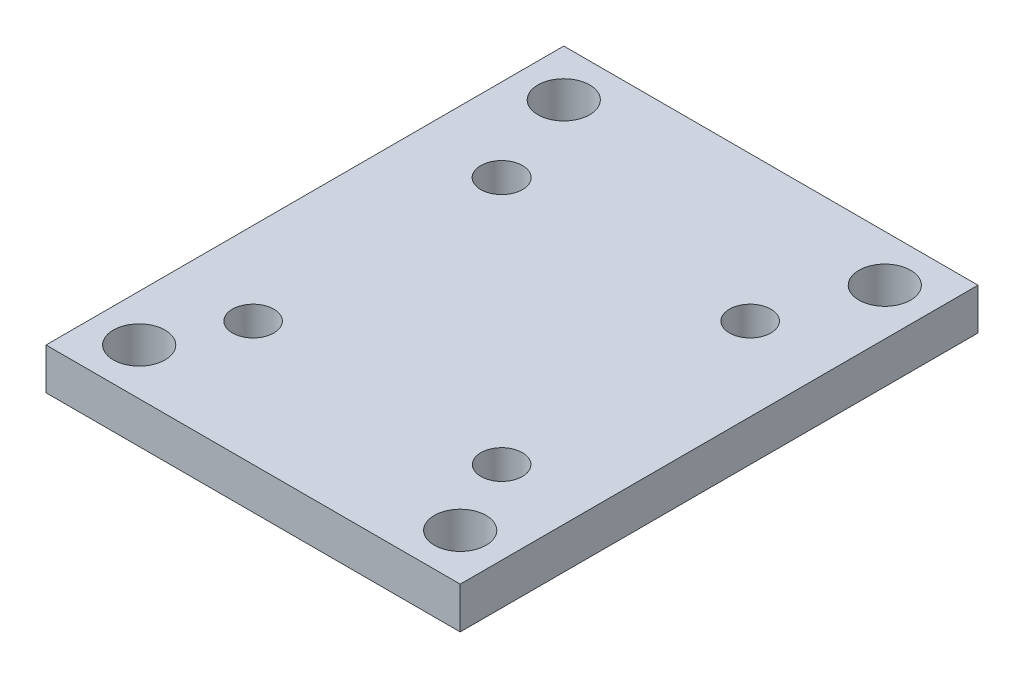
ISO-10303-21;
HEADER;
FILE_DESCRIPTION(('STEP AP214'),'2;1');
FILE_NAME('part.step','',(''),(''),'','','');
FILE_SCHEMA(('AUTOMOTIVE_DESIGN { 1 0 10303 214 1 1 1 1 }'));
ENDSEC;
DATA;
#1=APPLICATION_CONTEXT('core data for automotive mechanical design processes');
#2=APPLICATION_PROTOCOL_DEFINITION('international standard','automotive_design',2000,#1);
#3=PRODUCT_CONTEXT('',#1,'mechanical');
#4=PRODUCT('Part','Part','',(#3));
#5=PRODUCT_RELATED_PRODUCT_CATEGORY('part','',(#4));
#6=PRODUCT_DEFINITION_FORMATION('','',#4);
#7=PRODUCT_DEFINITION_CONTEXT('part definition',#1,'design');
#8=PRODUCT_DEFINITION('design','',#6,#7);
#9=PRODUCT_DEFINITION_SHAPE('','',#8);
#10=(LENGTH_UNIT() NAMED_UNIT(*) SI_UNIT(.MILLI.,.METRE.));
#11=(NAMED_UNIT(*) PLANE_ANGLE_UNIT() SI_UNIT($,.RADIAN.));
#12=(NAMED_UNIT(*) SI_UNIT($,.STERADIAN.) SOLID_ANGLE_UNIT());
#13=UNCERTAINTY_MEASURE_WITH_UNIT(LENGTH_MEASURE(1.E-05),#10,'distance_accuracy_value','');
#14=(GEOMETRIC_REPRESENTATION_CONTEXT(3) GLOBAL_UNCERTAINTY_ASSIGNED_CONTEXT((#13)) GLOBAL_UNIT_ASSIGNED_CONTEXT((#10,
#11,#12)) REPRESENTATION_CONTEXT('',''));
#15=CARTESIAN_POINT('',(0.,0.,0.));
#16=DIRECTION('',(0.,0.,1.));
#17=DIRECTION('',(1.,0.,0.));
#18=AXIS2_PLACEMENT_3D('',#15,#16,#17);
#19=CARTESIAN_POINT('',(0.,2.54,0.));
#20=DIRECTION('',(0.,-1.,0.));
#21=DIRECTION('',(0.,0.,-1.));
#22=AXIS2_PLACEMENT_3D('',#19,#20,#21);
#23=PLANE('',#22);
#24=CARTESIAN_POINT('',(20.32,2.54,-22.86));
#25=DIRECTION('',(0.,1.,0.));
#26=DIRECTION('',(0.,0.,1.));
#27=AXIS2_PLACEMENT_3D('',#24,#25,#26);
#28=CIRCLE('',#27,1.27);
#29=CARTESIAN_POINT('',(20.32,2.54,-21.59));
#30=VERTEX_POINT('',#29);
#31=EDGE_CURVE('E150',#30,#30,#28,.T.);
#32=ORIENTED_EDGE('',*,*,#31,.F.);
#33=EDGE_LOOP('',(#32));
#34=FACE_BOUND('',#33,.T.);
#35=CARTESIAN_POINT('',(5.08,2.54,-7.62000000000001));
#36=DIRECTION('',(0.,1.,0.));
#37=DIRECTION('',(0.,0.,1.));
#38=AXIS2_PLACEMENT_3D('',#35,#36,#37);
#39=CIRCLE('',#38,1.27);
#40=CARTESIAN_POINT('',(5.08,2.54,-6.35));
#41=VERTEX_POINT('',#40);
#42=EDGE_CURVE('E143',#41,#41,#39,.T.);
#43=ORIENTED_EDGE('',*,*,#42,.F.);
#44=EDGE_LOOP('',(#43));
#45=FACE_BOUND('',#44,.T.);
#46=CARTESIAN_POINT('',(20.32,2.54,-7.62));
#47=DIRECTION('',(0.,1.,0.));
#48=DIRECTION('',(0.,0.,1.));
#49=AXIS2_PLACEMENT_3D('',#46,#47,#48);
#50=CIRCLE('',#49,1.27);
#51=CARTESIAN_POINT('',(20.32,2.54,-6.35));
#52=VERTEX_POINT('',#51);
#53=EDGE_CURVE('E155',#52,#52,#50,.T.);
#54=ORIENTED_EDGE('',*,*,#53,.F.);
#55=EDGE_LOOP('',(#54));
#56=FACE_BOUND('',#55,.T.);
#57=CARTESIAN_POINT('',(5.07999999999999,2.54,-22.86));
#58=DIRECTION('',(0.,1.,0.));
#59=DIRECTION('',(0.,0.,1.));
#60=AXIS2_PLACEMENT_3D('',#57,#58,#59);
#61=CIRCLE('',#60,1.27966848023729);
#62=CARTESIAN_POINT('',(5.07999999999999,2.54,-21.5803315197627));
#63=VERTEX_POINT('',#62);
#64=EDGE_CURVE('E137',#63,#63,#61,.T.);
#65=ORIENTED_EDGE('',*,*,#64,.F.);
#66=EDGE_LOOP('',(#65));
#67=FACE_BOUND('',#66,.T.);
#68=DIRECTION('',(0.,0.,1.));
#69=VECTOR('',#68,1.);
#70=CARTESIAN_POINT('',(0.,2.54,0.));
#71=LINE('',#70,#69);
#72=CARTESIAN_POINT('',(0.,2.54,-31.75));
#73=VERTEX_POINT('',#72);
#74=CARTESIAN_POINT('',(0.,2.54,0.));
#75=VERTEX_POINT('',#74);
#76=EDGE_CURVE('E86',#73,#75,#71,.T.);
#77=ORIENTED_EDGE('',*,*,#76,.T.);
#78=DIRECTION('',(1.,0.,0.));
#79=VECTOR('',#78,1.);
#80=CARTESIAN_POINT('',(0.,2.54,0.));
#81=LINE('',#80,#79);
#82=CARTESIAN_POINT('',(25.4,2.54,0.));
#83=VERTEX_POINT('',#82);
#84=EDGE_CURVE('E81',#75,#83,#81,.T.);
#85=ORIENTED_EDGE('',*,*,#84,.T.);
#86=DIRECTION('',(0.,0.,-1.));
#87=VECTOR('',#86,1.);
#88=CARTESIAN_POINT('',(25.4,2.54,0.));
#89=LINE('',#88,#87);
#90=CARTESIAN_POINT('',(25.4,2.54,-31.75));
#91=VERTEX_POINT('',#90);
#92=EDGE_CURVE('E84',#83,#91,#89,.T.);
#93=ORIENTED_EDGE('',*,*,#92,.T.);
#94=DIRECTION('',(-1.,0.,0.));
#95=VECTOR('',#94,1.);
#96=CARTESIAN_POINT('',(0.,2.54,-31.75));
#97=LINE('',#96,#95);
#98=EDGE_CURVE('E51',#91,#73,#97,.T.);
#99=ORIENTED_EDGE('',*,*,#98,.T.);
#100=EDGE_LOOP('',(#77,#85,#93,#99));
#101=FACE_BOUND('',#100,.T.);
#102=CARTESIAN_POINT('',(2.8575,2.54,-28.8925));
#103=DIRECTION('',(0.,1.,0.));
#104=DIRECTION('',(0.,0.,1.));
#105=AXIS2_PLACEMENT_3D('',#102,#103,#104);
#106=CIRCLE('',#105,1.5875);
#107=CARTESIAN_POINT('',(2.8575,2.54,-27.305));
#108=VERTEX_POINT('',#107);
#109=EDGE_CURVE('E101',#108,#108,#106,.T.);
#110=ORIENTED_EDGE('',*,*,#109,.F.);
#111=EDGE_LOOP('',(#110));
#112=FACE_BOUND('',#111,.T.);
#113=CARTESIAN_POINT('',(22.5425,2.54,-28.8925));
#114=DIRECTION('',(0.,1.,0.));
#115=DIRECTION('',(0.,0.,1.));
#116=AXIS2_PLACEMENT_3D('',#113,#114,#115);
#117=CIRCLE('',#116,1.5875);
#118=CARTESIAN_POINT('',(22.5425,2.54,-27.305));
#119=VERTEX_POINT('',#118);
#120=EDGE_CURVE('E116',#119,#119,#117,.T.);
#121=ORIENTED_EDGE('',*,*,#120,.F.);
#122=EDGE_LOOP('',(#121));
#123=FACE_BOUND('',#122,.T.);
#124=CARTESIAN_POINT('',(2.8575,2.54,-2.8575));
#125=DIRECTION('',(0.,1.,0.));
#126=DIRECTION('',(0.,0.,1.));
#127=AXIS2_PLACEMENT_3D('',#124,#125,#126);
#128=CIRCLE('',#127,1.5875);
#129=CARTESIAN_POINT('',(2.8575,2.54,-1.27));
#130=VERTEX_POINT('',#129);
#131=EDGE_CURVE('E122',#130,#130,#128,.T.);
#132=ORIENTED_EDGE('',*,*,#131,.F.);
#133=EDGE_LOOP('',(#132));
#134=FACE_BOUND('',#133,.T.);
#135=CARTESIAN_POINT('',(22.5425,2.54,-2.8575));
#136=DIRECTION('',(0.,1.,0.));
#137=DIRECTION('',(0.,0.,1.));
#138=AXIS2_PLACEMENT_3D('',#135,#136,#137);
#139=CIRCLE('',#138,1.5875);
#140=CARTESIAN_POINT('',(22.5425,2.54,-1.27));
#141=VERTEX_POINT('',#140);
#142=EDGE_CURVE('E128',#141,#141,#139,.T.);
#143=ORIENTED_EDGE('',*,*,#142,.F.);
#144=EDGE_LOOP('',(#143));
#145=FACE_BOUND('',#144,.T.);
#146=ADVANCED_FACE('F34',(#34,#45,#56,#67,#101,#112,#123,#134,#145),#23,.F.);
#147=CARTESIAN_POINT('',(0.,0.,0.));
#148=DIRECTION('',(0.,-1.,0.));
#149=DIRECTION('',(0.,0.,-1.));
#150=AXIS2_PLACEMENT_3D('',#147,#148,#149);
#151=PLANE('',#150);
#152=CARTESIAN_POINT('',(20.32,0.,-22.86));
#153=DIRECTION('',(0.,1.,0.));
#154=DIRECTION('',(0.,0.,1.));
#155=AXIS2_PLACEMENT_3D('',#152,#153,#154);
#156=CIRCLE('',#155,1.27);
#157=CARTESIAN_POINT('',(20.32,0.,-21.59));
#158=VERTEX_POINT('',#157);
#159=EDGE_CURVE('E140',#158,#158,#156,.T.);
#160=ORIENTED_EDGE('',*,*,#159,.T.);
#161=EDGE_LOOP('',(#160));
#162=FACE_BOUND('',#161,.T.);
#163=CARTESIAN_POINT('',(5.08,0.,-7.62000000000001));
#164=DIRECTION('',(0.,1.,0.));
#165=DIRECTION('',(0.,0.,1.));
#166=AXIS2_PLACEMENT_3D('',#163,#164,#165);
#167=CIRCLE('',#166,1.27);
#168=CARTESIAN_POINT('',(5.08,0.,-6.35));
#169=VERTEX_POINT('',#168);
#170=EDGE_CURVE('E146',#169,#169,#167,.T.);
#171=ORIENTED_EDGE('',*,*,#170,.T.);
#172=EDGE_LOOP('',(#171));
#173=FACE_BOUND('',#172,.T.);
#174=CARTESIAN_POINT('',(20.32,0.,-7.62));
#175=DIRECTION('',(0.,1.,0.));
#176=DIRECTION('',(0.,0.,1.));
#177=AXIS2_PLACEMENT_3D('',#174,#175,#176);
#178=CIRCLE('',#177,1.27);
#179=CARTESIAN_POINT('',(20.32,0.,-6.35));
#180=VERTEX_POINT('',#179);
#181=EDGE_CURVE('E147',#180,#180,#178,.T.);
#182=ORIENTED_EDGE('',*,*,#181,.T.);
#183=EDGE_LOOP('',(#182));
#184=FACE_BOUND('',#183,.T.);
#185=CARTESIAN_POINT('',(5.07999999999999,0.,-22.86));
#186=DIRECTION('',(0.,1.,0.));
#187=DIRECTION('',(0.,0.,1.));
#188=AXIS2_PLACEMENT_3D('',#185,#186,#187);
#189=CIRCLE('',#188,1.27966848023729);
#190=CARTESIAN_POINT('',(5.07999999999999,0.,-21.5803315197627));
#191=VERTEX_POINT('',#190);
#192=EDGE_CURVE('E134',#191,#191,#189,.T.);
#193=ORIENTED_EDGE('',*,*,#192,.T.);
#194=EDGE_LOOP('',(#193));
#195=FACE_BOUND('',#194,.T.);
#196=CARTESIAN_POINT('',(2.8575,0.,-2.8575));
#197=DIRECTION('',(0.,1.,0.));
#198=DIRECTION('',(0.,0.,1.));
#199=AXIS2_PLACEMENT_3D('',#196,#197,#198);
#200=CIRCLE('',#199,1.5875);
#201=CARTESIAN_POINT('',(2.8575,0.,-1.27));
#202=VERTEX_POINT('',#201);
#203=EDGE_CURVE('E125',#202,#202,#200,.T.);
#204=ORIENTED_EDGE('',*,*,#203,.T.);
#205=EDGE_LOOP('',(#204));
#206=FACE_BOUND('',#205,.T.);
#207=CARTESIAN_POINT('',(2.8575,0.,-28.8925));
#208=DIRECTION('',(0.,1.,0.));
#209=DIRECTION('',(0.,0.,1.));
#210=AXIS2_PLACEMENT_3D('',#207,#208,#209);
#211=CIRCLE('',#210,1.5875);
#212=CARTESIAN_POINT('',(2.8575,0.,-27.305));
#213=VERTEX_POINT('',#212);
#214=EDGE_CURVE('E113',#213,#213,#211,.T.);
#215=ORIENTED_EDGE('',*,*,#214,.T.);
#216=EDGE_LOOP('',(#215));
#217=FACE_BOUND('',#216,.T.);
#218=DIRECTION('',(0.,0.,1.));
#219=VECTOR('',#218,1.);
#220=CARTESIAN_POINT('',(0.,0.,0.));
#221=LINE('',#220,#219);
#222=CARTESIAN_POINT('',(0.,0.,-31.75));
#223=VERTEX_POINT('',#222);
#224=CARTESIAN_POINT('',(0.,0.,0.));
#225=VERTEX_POINT('',#224);
#226=EDGE_CURVE('E98',#223,#225,#221,.T.);
#227=ORIENTED_EDGE('',*,*,#226,.F.);
#228=DIRECTION('',(-1.,0.,0.));
#229=VECTOR('',#228,1.);
#230=CARTESIAN_POINT('',(0.,0.,-31.75));
#231=LINE('',#230,#229);
#232=CARTESIAN_POINT('',(25.4,0.,-31.75));
#233=VERTEX_POINT('',#232);
#234=EDGE_CURVE('E74',#233,#223,#231,.T.);
#235=ORIENTED_EDGE('',*,*,#234,.F.);
#236=DIRECTION('',(0.,0.,-1.));
#237=VECTOR('',#236,1.);
#238=CARTESIAN_POINT('',(25.4,0.,0.));
#239=LINE('',#238,#237);
#240=CARTESIAN_POINT('',(25.4,0.,0.));
#241=VERTEX_POINT('',#240);
#242=EDGE_CURVE('E68',#241,#233,#239,.T.);
#243=ORIENTED_EDGE('',*,*,#242,.F.);
#244=DIRECTION('',(1.,0.,0.));
#245=VECTOR('',#244,1.);
#246=CARTESIAN_POINT('',(0.,0.,0.));
#247=LINE('',#246,#245);
#248=EDGE_CURVE('E90',#225,#241,#247,.T.);
#249=ORIENTED_EDGE('',*,*,#248,.F.);
#250=EDGE_LOOP('',(#227,#235,#243,#249));
#251=FACE_BOUND('',#250,.T.);
#252=CARTESIAN_POINT('',(22.5425,0.,-28.8925));
#253=DIRECTION('',(0.,1.,0.));
#254=DIRECTION('',(0.,0.,1.));
#255=AXIS2_PLACEMENT_3D('',#252,#253,#254);
#256=CIRCLE('',#255,1.5875);
#257=CARTESIAN_POINT('',(22.5425,0.,-27.305));
#258=VERTEX_POINT('',#257);
#259=EDGE_CURVE('E119',#258,#258,#256,.T.);
#260=ORIENTED_EDGE('',*,*,#259,.T.);
#261=EDGE_LOOP('',(#260));
#262=FACE_BOUND('',#261,.T.);
#263=CARTESIAN_POINT('',(22.5425,0.,-2.8575));
#264=DIRECTION('',(0.,1.,0.));
#265=DIRECTION('',(0.,0.,1.));
#266=AXIS2_PLACEMENT_3D('',#263,#264,#265);
#267=CIRCLE('',#266,1.5875);
#268=CARTESIAN_POINT('',(22.5425,0.,-1.27));
#269=VERTEX_POINT('',#268);
#270=EDGE_CURVE('E131',#269,#269,#267,.T.);
#271=ORIENTED_EDGE('',*,*,#270,.T.);
#272=EDGE_LOOP('',(#271));
#273=FACE_BOUND('',#272,.T.);
#274=ADVANCED_FACE('F109',(#162,#173,#184,#195,#206,#217,#251,#262,#273),#151,.T.);
#275=CARTESIAN_POINT('',(0.,2.54,0.));
#276=DIRECTION('',(1.,0.,0.));
#277=DIRECTION('',(0.,0.,-1.));
#278=AXIS2_PLACEMENT_3D('',#275,#276,#277);
#279=PLANE('',#278);
#280=ORIENTED_EDGE('',*,*,#226,.T.);
#281=DIRECTION('',(0.,-1.,0.));
#282=VECTOR('',#281,1.);
#283=CARTESIAN_POINT('',(0.,2.54,0.));
#284=LINE('',#283,#282);
#285=EDGE_CURVE('E11',#75,#225,#284,.T.);
#286=ORIENTED_EDGE('',*,*,#285,.F.);
#287=ORIENTED_EDGE('',*,*,#76,.F.);
#288=DIRECTION('',(0.,-1.,0.));
#289=VECTOR('',#288,1.);
#290=CARTESIAN_POINT('',(0.,2.54,-31.75));
#291=LINE('',#290,#289);
#292=EDGE_CURVE('E94',#73,#223,#291,.T.);
#293=ORIENTED_EDGE('',*,*,#292,.T.);
#294=EDGE_LOOP('',(#280,#286,#287,#293));
#295=FACE_BOUND('',#294,.T.);
#296=ADVANCED_FACE('F36',(#295),#279,.F.);
#297=CARTESIAN_POINT('',(0.,2.54,0.));
#298=DIRECTION('',(0.,0.,-1.));
#299=DIRECTION('',(-1.,0.,0.));
#300=AXIS2_PLACEMENT_3D('',#297,#298,#299);
#301=PLANE('',#300);
#302=ORIENTED_EDGE('',*,*,#248,.T.);
#303=DIRECTION('',(0.,-1.,0.));
#304=VECTOR('',#303,1.);
#305=CARTESIAN_POINT('',(25.4,2.54,0.));
#306=LINE('',#305,#304);
#307=EDGE_CURVE('E43',#83,#241,#306,.T.);
#308=ORIENTED_EDGE('',*,*,#307,.F.);
#309=ORIENTED_EDGE('',*,*,#84,.F.);
#310=ORIENTED_EDGE('',*,*,#285,.T.);
#311=EDGE_LOOP('',(#302,#308,#309,#310));
#312=FACE_BOUND('',#311,.T.);
#313=ADVANCED_FACE('F89',(#312),#301,.F.);
#314=CARTESIAN_POINT('',(25.4,2.54,0.));
#315=DIRECTION('',(-1.,0.,0.));
#316=DIRECTION('',(0.,0.,1.));
#317=AXIS2_PLACEMENT_3D('',#314,#315,#316);
#318=PLANE('',#317);
#319=ORIENTED_EDGE('',*,*,#242,.T.);
#320=DIRECTION('',(0.,-1.,0.));
#321=VECTOR('',#320,1.);
#322=CARTESIAN_POINT('',(25.4,2.54,-31.75));
#323=LINE('',#322,#321);
#324=EDGE_CURVE('E91',#91,#233,#323,.T.);
#325=ORIENTED_EDGE('',*,*,#324,.F.);
#326=ORIENTED_EDGE('',*,*,#92,.F.);
#327=ORIENTED_EDGE('',*,*,#307,.T.);
#328=EDGE_LOOP('',(#319,#325,#326,#327));
#329=FACE_BOUND('',#328,.T.);
#330=ADVANCED_FACE('F92',(#329),#318,.F.);
#331=CARTESIAN_POINT('',(0.,2.54,-31.75));
#332=DIRECTION('',(0.,0.,1.));
#333=DIRECTION('',(1.,0.,0.));
#334=AXIS2_PLACEMENT_3D('',#331,#332,#333);
#335=PLANE('',#334);
#336=ORIENTED_EDGE('',*,*,#234,.T.);
#337=ORIENTED_EDGE('',*,*,#292,.F.);
#338=ORIENTED_EDGE('',*,*,#98,.F.);
#339=ORIENTED_EDGE('',*,*,#324,.T.);
#340=EDGE_LOOP('',(#336,#337,#338,#339));
#341=FACE_BOUND('',#340,.T.);
#342=ADVANCED_FACE('F106',(#341),#335,.F.);
#343=CARTESIAN_POINT('',(2.8575,2.54,-28.8925));
#344=DIRECTION('',(0.,-1.,0.));
#345=DIRECTION('',(0.,0.,-1.));
#346=AXIS2_PLACEMENT_3D('',#343,#344,#345);
#347=CYLINDRICAL_SURFACE('',#346,1.5875);
#348=ORIENTED_EDGE('',*,*,#109,.T.);
#349=EDGE_LOOP('',(#348));
#350=FACE_BOUND('',#349,.T.);
#351=ORIENTED_EDGE('',*,*,#214,.F.);
#352=EDGE_LOOP('',(#351));
#353=FACE_BOUND('',#352,.T.);
#354=ADVANCED_FACE('F197',(#350,#353),#347,.F.);
#355=CARTESIAN_POINT('',(22.5425,2.54,-28.8925));
#356=DIRECTION('',(0.,-1.,0.));
#357=DIRECTION('',(0.,0.,-1.));
#358=AXIS2_PLACEMENT_3D('',#355,#356,#357);
#359=CYLINDRICAL_SURFACE('',#358,1.5875);
#360=ORIENTED_EDGE('',*,*,#120,.T.);
#361=EDGE_LOOP('',(#360));
#362=FACE_BOUND('',#361,.T.);
#363=ORIENTED_EDGE('',*,*,#259,.F.);
#364=EDGE_LOOP('',(#363));
#365=FACE_BOUND('',#364,.T.);
#366=ADVANCED_FACE('F193',(#362,#365),#359,.F.);
#367=CARTESIAN_POINT('',(2.8575,2.54,-2.8575));
#368=DIRECTION('',(0.,-1.,0.));
#369=DIRECTION('',(0.,0.,-1.));
#370=AXIS2_PLACEMENT_3D('',#367,#368,#369);
#371=CYLINDRICAL_SURFACE('',#370,1.5875);
#372=ORIENTED_EDGE('',*,*,#131,.T.);
#373=EDGE_LOOP('',(#372));
#374=FACE_BOUND('',#373,.T.);
#375=ORIENTED_EDGE('',*,*,#203,.F.);
#376=EDGE_LOOP('',(#375));
#377=FACE_BOUND('',#376,.T.);
#378=ADVANCED_FACE('F184',(#374,#377),#371,.F.);
#379=CARTESIAN_POINT('',(22.5425,2.54,-2.8575));
#380=DIRECTION('',(0.,-1.,0.));
#381=DIRECTION('',(0.,0.,-1.));
#382=AXIS2_PLACEMENT_3D('',#379,#380,#381);
#383=CYLINDRICAL_SURFACE('',#382,1.5875);
#384=ORIENTED_EDGE('',*,*,#142,.T.);
#385=EDGE_LOOP('',(#384));
#386=FACE_BOUND('',#385,.T.);
#387=ORIENTED_EDGE('',*,*,#270,.F.);
#388=EDGE_LOOP('',(#387));
#389=FACE_BOUND('',#388,.T.);
#390=ADVANCED_FACE('F178',(#386,#389),#383,.F.);
#391=CARTESIAN_POINT('',(5.07999999999999,0.,-22.86));
#392=DIRECTION('',(0.,1.,0.));
#393=DIRECTION('',(0.,0.,1.));
#394=AXIS2_PLACEMENT_3D('',#391,#392,#393);
#395=CYLINDRICAL_SURFACE('',#394,1.27966848023729);
#396=ORIENTED_EDGE('',*,*,#192,.F.);
#397=EDGE_LOOP('',(#396));
#398=FACE_BOUND('',#397,.T.);
#399=ORIENTED_EDGE('',*,*,#64,.T.);
#400=EDGE_LOOP('',(#399));
#401=FACE_BOUND('',#400,.T.);
#402=ADVANCED_FACE('F167',(#398,#401),#395,.F.);
#403=CARTESIAN_POINT('',(20.32,0.,-7.62));
#404=DIRECTION('',(0.,1.,0.));
#405=DIRECTION('',(0.,0.,1.));
#406=AXIS2_PLACEMENT_3D('',#403,#404,#405);
#407=CYLINDRICAL_SURFACE('',#406,1.27);
#408=ORIENTED_EDGE('',*,*,#181,.F.);
#409=EDGE_LOOP('',(#408));
#410=FACE_BOUND('',#409,.T.);
#411=ORIENTED_EDGE('',*,*,#53,.T.);
#412=EDGE_LOOP('',(#411));
#413=FACE_BOUND('',#412,.T.);
#414=ADVANCED_FACE('F163',(#410,#413),#407,.F.);
#415=CARTESIAN_POINT('',(5.08,0.,-7.62000000000001));
#416=DIRECTION('',(0.,1.,0.));
#417=DIRECTION('',(0.,0.,1.));
#418=AXIS2_PLACEMENT_3D('',#415,#416,#417);
#419=CYLINDRICAL_SURFACE('',#418,1.27);
#420=ORIENTED_EDGE('',*,*,#170,.F.);
#421=EDGE_LOOP('',(#420));
#422=FACE_BOUND('',#421,.T.);
#423=ORIENTED_EDGE('',*,*,#42,.T.);
#424=EDGE_LOOP('',(#423));
#425=FACE_BOUND('',#424,.T.);
#426=ADVANCED_FACE('F166',(#422,#425),#419,.F.);
#427=CARTESIAN_POINT('',(20.32,0.,-22.86));
#428=DIRECTION('',(0.,1.,0.));
#429=DIRECTION('',(0.,0.,1.));
#430=AXIS2_PLACEMENT_3D('',#427,#428,#429);
#431=CYLINDRICAL_SURFACE('',#430,1.27);
#432=ORIENTED_EDGE('',*,*,#159,.F.);
#433=EDGE_LOOP('',(#432));
#434=FACE_BOUND('',#433,.T.);
#435=ORIENTED_EDGE('',*,*,#31,.T.);
#436=EDGE_LOOP('',(#435));
#437=FACE_BOUND('',#436,.T.);
#438=ADVANCED_FACE('F285',(#434,#437),#431,.F.);
#439=CLOSED_SHELL('',(#146,#274,#296,#313,#330,#342,#354,#366,#378,#390,#402,#414,#426,#438));
#440=MANIFOLD_SOLID_BREP('B2',#439);
#441=ADVANCED_BREP_SHAPE_REPRESENTATION('',(#18,#440),#14);
#442=SHAPE_DEFINITION_REPRESENTATION(#9,#441);
ENDSEC;
END-ISO-10303-21;
